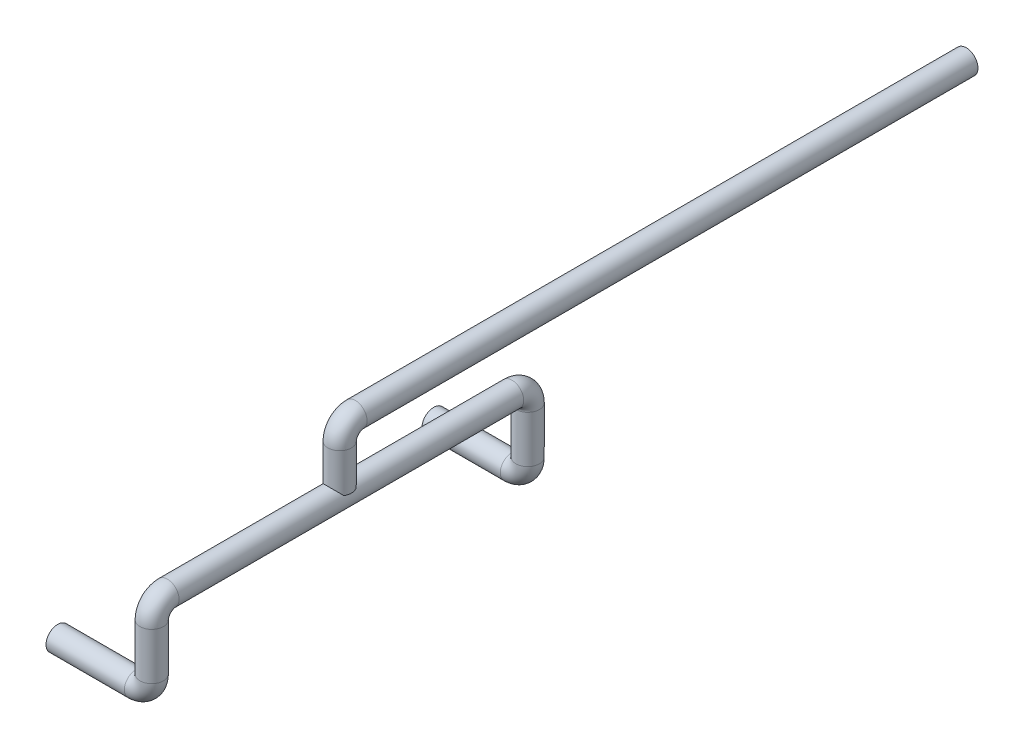
ISO-10303-21;
HEADER;
FILE_DESCRIPTION(('STEP AP214'),'2;1');
FILE_NAME('part.step','',(''),(''),'','','');
FILE_SCHEMA(('AUTOMOTIVE_DESIGN { 1 0 10303 214 1 1 1 1 }'));
ENDSEC;
DATA;
#1=APPLICATION_CONTEXT('core data for automotive mechanical design processes');
#2=APPLICATION_PROTOCOL_DEFINITION('international standard','automotive_design',2000,#1);
#3=PRODUCT_CONTEXT('',#1,'mechanical');
#4=PRODUCT('Part','Part','',(#3));
#5=PRODUCT_RELATED_PRODUCT_CATEGORY('part','',(#4));
#6=PRODUCT_DEFINITION_FORMATION('','',#4);
#7=PRODUCT_DEFINITION_CONTEXT('part definition',#1,'design');
#8=PRODUCT_DEFINITION('design','',#6,#7);
#9=PRODUCT_DEFINITION_SHAPE('','',#8);
#10=(LENGTH_UNIT() NAMED_UNIT(*) SI_UNIT(.MILLI.,.METRE.));
#11=(NAMED_UNIT(*) PLANE_ANGLE_UNIT() SI_UNIT($,.RADIAN.));
#12=(NAMED_UNIT(*) SI_UNIT($,.STERADIAN.) SOLID_ANGLE_UNIT());
#13=UNCERTAINTY_MEASURE_WITH_UNIT(LENGTH_MEASURE(1.E-05),#10,'distance_accuracy_value','');
#14=(GEOMETRIC_REPRESENTATION_CONTEXT(3) GLOBAL_UNCERTAINTY_ASSIGNED_CONTEXT((#13)) GLOBAL_UNIT_ASSIGNED_CONTEXT((#10,
#11,#12)) REPRESENTATION_CONTEXT('',''));
#15=CARTESIAN_POINT('',(0.,0.,0.));
#16=DIRECTION('',(0.,0.,1.));
#17=DIRECTION('',(1.,0.,0.));
#18=AXIS2_PLACEMENT_3D('',#15,#16,#17);
#19=CARTESIAN_POINT('',(0.,0.,110.));
#20=DIRECTION('',(0.,0.,-1.));
#21=DIRECTION('',(-1.,0.,0.));
#22=AXIS2_PLACEMENT_3D('',#19,#20,#21);
#23=CYLINDRICAL_SURFACE('',#22,7.50000000000001);
#24=CARTESIAN_POINT('',(0.,0.,110.));
#25=DIRECTION('',(0.,0.,1.));
#26=DIRECTION('',(0.,1.,0.));
#27=AXIS2_PLACEMENT_3D('',#24,#25,#26);
#28=CIRCLE('',#27,7.50000000000001);
#29=CARTESIAN_POINT('',(0.,7.5,110.));
#30=VERTEX_POINT('',#29);
#31=EDGE_CURVE('E211',#30,#30,#28,.T.);
#32=ORIENTED_EDGE('',*,*,#31,.F.);
#33=EDGE_LOOP('',(#32));
#34=FACE_BOUND('',#33,.T.);
#35=CARTESIAN_POINT('',(0.,0.,-110.));
#36=DIRECTION('',(0.,0.,1.));
#37=DIRECTION('',(0.,1.,0.));
#38=AXIS2_PLACEMENT_3D('',#35,#36,#37);
#39=CIRCLE('',#38,7.50000000000001);
#40=CARTESIAN_POINT('',(0.,7.50000000000001,-110.));
#41=VERTEX_POINT('',#40);
#42=EDGE_CURVE('E214',#41,#41,#39,.T.);
#43=ORIENTED_EDGE('',*,*,#42,.T.);
#44=EDGE_LOOP('',(#43));
#45=FACE_BOUND('',#44,.T.);
#46=CARTESIAN_POINT('',(0.,0.,0.));
#47=DIRECTION('',(0.,0.707106781186547,-0.707106781186547));
#48=DIRECTION('',(0.,-0.707106781186547,-0.707106781186547));
#49=AXIS2_PLACEMENT_3D('',#46,#47,#48);
#50=ELLIPSE('',#49,10.6066017177982,7.5);
#51=CARTESIAN_POINT('',(-6.47252088797244,3.78899371268421,3.78899371268421));
#52=VERTEX_POINT('',#51);
#53=CARTESIAN_POINT('',(6.47252088797245,3.78899371268421,3.78899371268418));
#54=VERTEX_POINT('',#53);
#55=EDGE_CURVE('E103',#52,#54,#50,.T.);
#56=ORIENTED_EDGE('',*,*,#55,.F.);
#57=DIRECTION('',(0.,0.,-1.));
#58=VECTOR('',#57,1.);
#59=CARTESIAN_POINT('',(-6.47252088797244,3.78899371268421,110.));
#60=LINE('',#59,#58);
#61=CARTESIAN_POINT('',(-6.47252088797244,3.78899371268421,-3.78899371268421));
#62=VERTEX_POINT('',#61);
#63=EDGE_CURVE('E234',#52,#62,#60,.T.);
#64=ORIENTED_EDGE('',*,*,#63,.T.);
#65=CARTESIAN_POINT('',(0.,0.,0.));
#66=DIRECTION('',(0.,-0.707106781186547,-0.707106781186547));
#67=DIRECTION('',(0.,0.707106781186547,-0.707106781186547));
#68=AXIS2_PLACEMENT_3D('',#65,#66,#67);
#69=ELLIPSE('',#68,10.6066017177982,7.5);
#70=CARTESIAN_POINT('',(6.47252088797244,3.78899371268421,-3.78899371268421));
#71=VERTEX_POINT('',#70);
#72=EDGE_CURVE('E229',#71,#62,#69,.F.);
#73=ORIENTED_EDGE('',*,*,#72,.F.);
#74=DIRECTION('',(0.,0.,-1.));
#75=VECTOR('',#74,1.);
#76=CARTESIAN_POINT('',(6.47252088797245,3.78899371268421,110.));
#77=LINE('',#76,#75);
#78=EDGE_CURVE('E232',#71,#54,#77,.F.);
#79=ORIENTED_EDGE('',*,*,#78,.T.);
#80=EDGE_LOOP('',(#56,#64,#73,#79));
#81=FACE_BOUND('',#80,.T.);
#82=ADVANCED_FACE('F81',(#34,#45,#81),#23,.T.);
#83=CARTESIAN_POINT('',(-60.,-50.,120.));
#84=DIRECTION('',(-1.,0.,0.));
#85=DIRECTION('',(0.,0.,1.));
#86=AXIS2_PLACEMENT_3D('',#83,#84,#85);
#87=PLANE('',#86);
#88=CARTESIAN_POINT('',(-60.,-50.,120.));
#89=DIRECTION('',(-1.,0.,0.));
#90=DIRECTION('',(0.,0.,1.));
#91=AXIS2_PLACEMENT_3D('',#88,#89,#90);
#92=CIRCLE('',#91,6.25000000000001);
#93=CARTESIAN_POINT('',(-60.,-50.,126.25));
#94=VERTEX_POINT('',#93);
#95=EDGE_CURVE('E158',#94,#94,#92,.T.);
#96=ORIENTED_EDGE('',*,*,#95,.F.);
#97=EDGE_LOOP('',(#96));
#98=FACE_BOUND('',#97,.T.);
#99=CARTESIAN_POINT('',(-60.,-50.,120.));
#100=DIRECTION('',(-1.,0.,0.));
#101=DIRECTION('',(0.,0.,1.));
#102=AXIS2_PLACEMENT_3D('',#99,#100,#101);
#103=CIRCLE('',#102,7.50000000000001);
#104=CARTESIAN_POINT('',(-60.,-50.,127.5));
#105=VERTEX_POINT('',#104);
#106=EDGE_CURVE('E199',#105,#105,#103,.T.);
#107=ORIENTED_EDGE('',*,*,#106,.T.);
#108=EDGE_LOOP('',(#107));
#109=FACE_BOUND('',#108,.T.);
#110=ADVANCED_FACE('F83',(#98,#109),#87,.T.);
#111=CARTESIAN_POINT('',(-60.,-50.,-120.));
#112=DIRECTION('',(1.,0.,0.));
#113=DIRECTION('',(0.,0.,-1.));
#114=AXIS2_PLACEMENT_3D('',#111,#112,#113);
#115=PLANE('',#114);
#116=CARTESIAN_POINT('',(-60.,-50.,-120.));
#117=DIRECTION('',(1.,0.,0.));
#118=DIRECTION('',(0.,0.,-1.));
#119=AXIS2_PLACEMENT_3D('',#116,#117,#118);
#120=CIRCLE('',#119,6.25000000000001);
#121=CARTESIAN_POINT('',(-60.,-50.,-126.25));
#122=VERTEX_POINT('',#121);
#123=EDGE_CURVE('E155',#122,#122,#120,.T.);
#124=ORIENTED_EDGE('',*,*,#123,.T.);
#125=EDGE_LOOP('',(#124));
#126=FACE_BOUND('',#125,.T.);
#127=CARTESIAN_POINT('',(-60.,-50.,-120.));
#128=DIRECTION('',(1.,0.,0.));
#129=DIRECTION('',(0.,0.,-1.));
#130=AXIS2_PLACEMENT_3D('',#127,#128,#129);
#131=CIRCLE('',#130,7.50000000000001);
#132=CARTESIAN_POINT('',(-60.,-50.,-127.5));
#133=VERTEX_POINT('',#132);
#134=EDGE_CURVE('E226',#133,#133,#131,.T.);
#135=ORIENTED_EDGE('',*,*,#134,.F.);
#136=EDGE_LOOP('',(#135));
#137=FACE_BOUND('',#136,.T.);
#138=ADVANCED_FACE('F270',(#126,#137),#115,.F.);
#139=CARTESIAN_POINT('',(-60.,-50.,120.));
#140=DIRECTION('',(1.,0.,0.));
#141=DIRECTION('',(0.,0.,-1.));
#142=AXIS2_PLACEMENT_3D('',#139,#140,#141);
#143=CYLINDRICAL_SURFACE('',#142,7.50000000000001);
#144=CARTESIAN_POINT('',(-10.,-50.,120.));
#145=DIRECTION('',(-1.,0.,0.));
#146=DIRECTION('',(0.,0.,1.));
#147=AXIS2_PLACEMENT_3D('',#144,#145,#146);
#148=CIRCLE('',#147,7.50000000000001);
#149=CARTESIAN_POINT('',(-10.,-57.5,120.));
#150=VERTEX_POINT('',#149);
#151=EDGE_CURVE('E202',#150,#150,#148,.T.);
#152=ORIENTED_EDGE('',*,*,#151,.T.);
#153=EDGE_LOOP('',(#152));
#154=FACE_BOUND('',#153,.T.);
#155=ORIENTED_EDGE('',*,*,#106,.F.);
#156=EDGE_LOOP('',(#155));
#157=FACE_BOUND('',#156,.T.);
#158=ADVANCED_FACE('F294',(#154,#157),#143,.T.);
#159=CARTESIAN_POINT('',(-10.,-40.,120.));
#160=DIRECTION('',(0.,0.,1.));
#161=DIRECTION('',(1.,0.,0.));
#162=AXIS2_PLACEMENT_3D('',#159,#160,#161);
#163=TOROIDAL_SURFACE('',#162,10.,7.50000000000001);
#164=CARTESIAN_POINT('',(0.,-40.,120.));
#165=DIRECTION('',(0.,-1.,0.));
#166=DIRECTION('',(0.,0.,1.));
#167=AXIS2_PLACEMENT_3D('',#164,#165,#166);
#168=CIRCLE('',#167,7.50000000000001);
#169=CARTESIAN_POINT('',(7.50000000000002,-40.,120.));
#170=VERTEX_POINT('',#169);
#171=EDGE_CURVE('E205',#170,#170,#168,.T.);
#172=CARTESIAN_POINT('',(-10.,-40.,120.));
#173=DIRECTION('',(0.,0.,1.));
#174=DIRECTION('',(1.,0.,0.));
#175=AXIS2_PLACEMENT_3D('',#172,#173,#174);
#176=CIRCLE('',#175,17.5);
#177=EDGE_CURVE('',#150,#170,#176,.T.);
#178=ORIENTED_EDGE('',*,*,#151,.F.);
#179=ORIENTED_EDGE('',*,*,#171,.T.);
#180=ORIENTED_EDGE('',*,*,#177,.T.);
#181=ORIENTED_EDGE('',*,*,#177,.F.);
#182=EDGE_LOOP('',(#178,#180,#179,#181));
#183=FACE_BOUND('',#182,.T.);
#184=ADVANCED_FACE('F299',(#183),#163,.T.);
#185=CARTESIAN_POINT('',(0.,-40.,120.));
#186=DIRECTION('',(0.,1.,0.));
#187=DIRECTION('',(-1.,0.,0.));
#188=AXIS2_PLACEMENT_3D('',#185,#186,#187);
#189=CYLINDRICAL_SURFACE('',#188,7.50000000000001);
#190=CARTESIAN_POINT('',(0.,-10.,120.));
#191=DIRECTION('',(0.,-1.,0.));
#192=DIRECTION('',(0.,0.,1.));
#193=AXIS2_PLACEMENT_3D('',#190,#191,#192);
#194=CIRCLE('',#193,7.50000000000001);
#195=CARTESIAN_POINT('',(0.,-10.,127.5));
#196=VERTEX_POINT('',#195);
#197=EDGE_CURVE('E208',#196,#196,#194,.T.);
#198=ORIENTED_EDGE('',*,*,#197,.T.);
#199=EDGE_LOOP('',(#198));
#200=FACE_BOUND('',#199,.T.);
#201=ORIENTED_EDGE('',*,*,#171,.F.);
#202=EDGE_LOOP('',(#201));
#203=FACE_BOUND('',#202,.T.);
#204=ADVANCED_FACE('F361',(#200,#203),#189,.T.);
#205=CARTESIAN_POINT('',(0.,-10.,110.));
#206=DIRECTION('',(-1.,0.,0.));
#207=DIRECTION('',(0.,0.,1.));
#208=AXIS2_PLACEMENT_3D('',#205,#206,#207);
#209=TOROIDAL_SURFACE('',#208,9.99999999999999,7.50000000000001);
#210=CARTESIAN_POINT('',(0.,-10.,110.));
#211=DIRECTION('',(-1.,0.,0.));
#212=DIRECTION('',(0.,0.,1.));
#213=AXIS2_PLACEMENT_3D('',#210,#211,#212);
#214=CIRCLE('',#213,17.5);
#215=EDGE_CURVE('',#196,#30,#214,.T.);
#216=ORIENTED_EDGE('',*,*,#197,.F.);
#217=ORIENTED_EDGE('',*,*,#31,.T.);
#218=ORIENTED_EDGE('',*,*,#215,.T.);
#219=ORIENTED_EDGE('',*,*,#215,.F.);
#220=EDGE_LOOP('',(#216,#218,#217,#219));
#221=FACE_BOUND('',#220,.T.);
#222=ADVANCED_FACE('F364',(#221),#209,.T.);
#223=CARTESIAN_POINT('',(0.,-10.,-110.));
#224=DIRECTION('',(-1.,0.,0.));
#225=DIRECTION('',(0.,0.,1.));
#226=AXIS2_PLACEMENT_3D('',#223,#224,#225);
#227=TOROIDAL_SURFACE('',#226,10.,7.50000000000001);
#228=CARTESIAN_POINT('',(0.,-9.99999999999999,-120.));
#229=DIRECTION('',(0.,1.,0.));
#230=DIRECTION('',(0.,0.,-1.));
#231=AXIS2_PLACEMENT_3D('',#228,#229,#230);
#232=CIRCLE('',#231,7.50000000000001);
#233=CARTESIAN_POINT('',(0.,-9.99999999999999,-127.5));
#234=VERTEX_POINT('',#233);
#235=EDGE_CURVE('E217',#234,#234,#232,.T.);
#236=CARTESIAN_POINT('',(0.,-10.,-110.));
#237=DIRECTION('',(-1.,0.,0.));
#238=DIRECTION('',(0.,0.,1.));
#239=AXIS2_PLACEMENT_3D('',#236,#237,#238);
#240=CIRCLE('',#239,17.5);
#241=EDGE_CURVE('',#41,#234,#240,.T.);
#242=ORIENTED_EDGE('',*,*,#42,.F.);
#243=ORIENTED_EDGE('',*,*,#235,.T.);
#244=ORIENTED_EDGE('',*,*,#241,.T.);
#245=ORIENTED_EDGE('',*,*,#241,.F.);
#246=EDGE_LOOP('',(#242,#244,#243,#245));
#247=FACE_BOUND('',#246,.T.);
#248=ADVANCED_FACE('F367',(#247),#227,.T.);
#249=CARTESIAN_POINT('',(0.,-9.99999999999999,-120.));
#250=DIRECTION('',(0.,-1.,0.));
#251=DIRECTION('',(0.,0.,-1.));
#252=AXIS2_PLACEMENT_3D('',#249,#250,#251);
#253=CYLINDRICAL_SURFACE('',#252,7.50000000000001);
#254=CARTESIAN_POINT('',(0.,-40.,-120.));
#255=DIRECTION('',(0.,1.,0.));
#256=DIRECTION('',(0.,0.,-1.));
#257=AXIS2_PLACEMENT_3D('',#254,#255,#256);
#258=CIRCLE('',#257,7.50000000000001);
#259=CARTESIAN_POINT('',(7.50000000000002,-40.,-120.));
#260=VERTEX_POINT('',#259);
#261=EDGE_CURVE('E220',#260,#260,#258,.T.);
#262=ORIENTED_EDGE('',*,*,#261,.T.);
#263=EDGE_LOOP('',(#262));
#264=FACE_BOUND('',#263,.T.);
#265=ORIENTED_EDGE('',*,*,#235,.F.);
#266=EDGE_LOOP('',(#265));
#267=FACE_BOUND('',#266,.T.);
#268=ADVANCED_FACE('F288',(#264,#267),#253,.T.);
#269=CARTESIAN_POINT('',(-10.,-40.,-120.));
#270=DIRECTION('',(0.,0.,-1.));
#271=DIRECTION('',(-1.,0.,0.));
#272=AXIS2_PLACEMENT_3D('',#269,#270,#271);
#273=TOROIDAL_SURFACE('',#272,10.,7.50000000000001);
#274=CARTESIAN_POINT('',(-10.,-50.,-120.));
#275=DIRECTION('',(1.,0.,0.));
#276=DIRECTION('',(0.,0.,-1.));
#277=AXIS2_PLACEMENT_3D('',#274,#275,#276);
#278=CIRCLE('',#277,7.50000000000001);
#279=CARTESIAN_POINT('',(-10.,-57.5,-120.));
#280=VERTEX_POINT('',#279);
#281=EDGE_CURVE('E223',#280,#280,#278,.T.);
#282=CARTESIAN_POINT('',(-10.,-40.,-120.));
#283=DIRECTION('',(0.,0.,-1.));
#284=DIRECTION('',(-1.,0.,0.));
#285=AXIS2_PLACEMENT_3D('',#282,#283,#284);
#286=CIRCLE('',#285,17.5);
#287=EDGE_CURVE('',#260,#280,#286,.T.);
#288=ORIENTED_EDGE('',*,*,#261,.F.);
#289=ORIENTED_EDGE('',*,*,#281,.T.);
#290=ORIENTED_EDGE('',*,*,#287,.T.);
#291=ORIENTED_EDGE('',*,*,#287,.F.);
#292=EDGE_LOOP('',(#288,#290,#289,#291));
#293=FACE_BOUND('',#292,.T.);
#294=ADVANCED_FACE('F278',(#293),#273,.T.);
#295=CARTESIAN_POINT('',(-9.99999999999999,-50.,-120.));
#296=DIRECTION('',(-1.,0.,0.));
#297=DIRECTION('',(0.,0.,1.));
#298=AXIS2_PLACEMENT_3D('',#295,#296,#297);
#299=CYLINDRICAL_SURFACE('',#298,7.50000000000001);
#300=ORIENTED_EDGE('',*,*,#134,.T.);
#301=EDGE_LOOP('',(#300));
#302=FACE_BOUND('',#301,.T.);
#303=ORIENTED_EDGE('',*,*,#281,.F.);
#304=EDGE_LOOP('',(#303));
#305=FACE_BOUND('',#304,.T.);
#306=ADVANCED_FACE('F266',(#302,#305),#299,.T.);
#307=CARTESIAN_POINT('',(0.,3.78899371268421,0.));
#308=DIRECTION('',(0.,-1.,0.));
#309=DIRECTION('',(1.,0.,0.));
#310=AXIS2_PLACEMENT_3D('',#307,#308,#309);
#311=PLANE('',#310);
#312=ORIENTED_EDGE('',*,*,#63,.F.);
#313=CARTESIAN_POINT('',(0.,3.78899371268421,0.));
#314=DIRECTION('',(0.,-1.,0.));
#315=DIRECTION('',(1.,0.,0.));
#316=AXIS2_PLACEMENT_3D('',#313,#314,#315);
#317=CIRCLE('',#316,7.5);
#318=EDGE_CURVE('E189',#52,#62,#317,.T.);
#319=ORIENTED_EDGE('',*,*,#318,.T.);
#320=EDGE_LOOP('',(#312,#319));
#321=FACE_BOUND('',#320,.T.);
#322=ADVANCED_FACE('F272',(#321),#311,.T.);
#323=ORIENTED_EDGE('',*,*,#78,.F.);
#324=EDGE_CURVE('E186',#71,#54,#317,.T.);
#325=ORIENTED_EDGE('',*,*,#324,.T.);
#326=EDGE_LOOP('',(#323,#325));
#327=FACE_BOUND('',#326,.T.);
#328=ADVANCED_FACE('F285',(#327),#311,.T.);
#329=CARTESIAN_POINT('',(0.,3.78899371268421,0.));
#330=DIRECTION('',(0.,1.,0.));
#331=DIRECTION('',(0.,0.,1.));
#332=AXIS2_PLACEMENT_3D('',#329,#330,#331);
#333=CYLINDRICAL_SURFACE('',#332,7.5);
#334=CARTESIAN_POINT('',(0.,28.7889937126842,0.));
#335=DIRECTION('',(0.,-1.,0.));
#336=DIRECTION('',(1.,0.,0.));
#337=AXIS2_PLACEMENT_3D('',#334,#335,#336);
#338=CIRCLE('',#337,7.5);
#339=CARTESIAN_POINT('',(0.,28.7889937126843,7.5));
#340=VERTEX_POINT('',#339);
#341=EDGE_CURVE('E190',#340,#340,#338,.T.);
#342=ORIENTED_EDGE('',*,*,#341,.T.);
#343=EDGE_LOOP('',(#342));
#344=FACE_BOUND('',#343,.T.);
#345=ORIENTED_EDGE('',*,*,#318,.F.);
#346=ORIENTED_EDGE('',*,*,#55,.T.);
#347=ORIENTED_EDGE('',*,*,#324,.F.);
#348=ORIENTED_EDGE('',*,*,#72,.T.);
#349=EDGE_LOOP('',(#345,#346,#347,#348));
#350=FACE_BOUND('',#349,.T.);
#351=ADVANCED_FACE('F345',(#344,#350),#333,.T.);
#352=CARTESIAN_POINT('',(0.,38.7889937126842,-400.));
#353=DIRECTION('',(0.,0.,1.));
#354=DIRECTION('',(1.,0.,0.));
#355=AXIS2_PLACEMENT_3D('',#352,#353,#354);
#356=PLANE('',#355);
#357=CARTESIAN_POINT('',(0.,38.7889937126841,-400.));
#358=DIRECTION('',(0.,0.,1.));
#359=DIRECTION('',(1.,0.,0.));
#360=AXIS2_PLACEMENT_3D('',#357,#358,#359);
#361=CIRCLE('',#360,6.25);
#362=CARTESIAN_POINT('',(6.25,38.7889937126841,-400.));
#363=VERTEX_POINT('',#362);
#364=EDGE_CURVE('E146',#363,#363,#361,.T.);
#365=ORIENTED_EDGE('',*,*,#364,.T.);
#366=EDGE_LOOP('',(#365));
#367=FACE_BOUND('',#366,.T.);
#368=CARTESIAN_POINT('',(0.,38.7889937126842,-400.));
#369=DIRECTION('',(0.,0.,1.));
#370=DIRECTION('',(1.,0.,0.));
#371=AXIS2_PLACEMENT_3D('',#368,#369,#370);
#372=CIRCLE('',#371,7.5);
#373=CARTESIAN_POINT('',(7.5,38.7889937126842,-400.));
#374=VERTEX_POINT('',#373);
#375=EDGE_CURVE('E196',#374,#374,#372,.T.);
#376=ORIENTED_EDGE('',*,*,#375,.F.);
#377=EDGE_LOOP('',(#376));
#378=FACE_BOUND('',#377,.T.);
#379=ADVANCED_FACE('F344',(#367,#378),#356,.F.);
#380=CARTESIAN_POINT('',(0.,28.7889937126842,-10.));
#381=DIRECTION('',(-1.,0.,0.));
#382=DIRECTION('',(0.,0.,1.));
#383=AXIS2_PLACEMENT_3D('',#380,#381,#382);
#384=TOROIDAL_SURFACE('',#383,10.,7.5);
#385=CARTESIAN_POINT('',(0.,38.7889937126842,-10.0000000000001));
#386=DIRECTION('',(0.,0.,1.));
#387=DIRECTION('',(1.,0.,0.));
#388=AXIS2_PLACEMENT_3D('',#385,#386,#387);
#389=CIRCLE('',#388,7.5);
#390=CARTESIAN_POINT('',(0.,46.2889937126842,-10.0000000000001));
#391=VERTEX_POINT('',#390);
#392=EDGE_CURVE('E193',#391,#391,#389,.T.);
#393=CARTESIAN_POINT('',(0.,28.7889937126842,-10.));
#394=DIRECTION('',(-1.,0.,0.));
#395=DIRECTION('',(0.,0.,1.));
#396=AXIS2_PLACEMENT_3D('',#393,#394,#395);
#397=CIRCLE('',#396,17.5);
#398=EDGE_CURVE('',#340,#391,#397,.T.);
#399=ORIENTED_EDGE('',*,*,#341,.F.);
#400=ORIENTED_EDGE('',*,*,#392,.T.);
#401=ORIENTED_EDGE('',*,*,#398,.T.);
#402=ORIENTED_EDGE('',*,*,#398,.F.);
#403=EDGE_LOOP('',(#399,#401,#400,#402));
#404=FACE_BOUND('',#403,.T.);
#405=ADVANCED_FACE('F349',(#404),#384,.T.);
#406=CARTESIAN_POINT('',(0.,38.7889937126842,-10.0000000000001));
#407=DIRECTION('',(0.,0.,-1.));
#408=DIRECTION('',(-1.,0.,0.));
#409=AXIS2_PLACEMENT_3D('',#406,#407,#408);
#410=CYLINDRICAL_SURFACE('',#409,7.5);
#411=ORIENTED_EDGE('',*,*,#375,.T.);
#412=EDGE_LOOP('',(#411));
#413=FACE_BOUND('',#412,.T.);
#414=ORIENTED_EDGE('',*,*,#392,.F.);
#415=EDGE_LOOP('',(#414));
#416=FACE_BOUND('',#415,.T.);
#417=ADVANCED_FACE('F342',(#413,#416),#410,.T.);
#418=CARTESIAN_POINT('',(-64.9999999999999,-50.,120.));
#419=DIRECTION('',(1.,0.,0.));
#420=DIRECTION('',(0.,0.,-1.));
#421=AXIS2_PLACEMENT_3D('',#418,#419,#420);
#422=CYLINDRICAL_SURFACE('',#421,6.25000000000001);
#423=CARTESIAN_POINT('',(-10.,-50.,120.));
#424=DIRECTION('',(-1.,0.,0.));
#425=DIRECTION('',(0.,0.,1.));
#426=AXIS2_PLACEMENT_3D('',#423,#424,#425);
#427=CIRCLE('',#426,6.25000000000001);
#428=CARTESIAN_POINT('',(-10.,-56.25,120.));
#429=VERTEX_POINT('',#428);
#430=EDGE_CURVE('E154',#429,#429,#427,.T.);
#431=ORIENTED_EDGE('',*,*,#430,.F.);
#432=EDGE_LOOP('',(#431));
#433=FACE_BOUND('',#432,.T.);
#434=ORIENTED_EDGE('',*,*,#95,.T.);
#435=EDGE_LOOP('',(#434));
#436=FACE_BOUND('',#435,.T.);
#437=ADVANCED_FACE('F311',(#433,#436),#422,.F.);
#438=CARTESIAN_POINT('',(-10.,-40.,120.));
#439=DIRECTION('',(0.,0.,1.));
#440=DIRECTION('',(1.,0.,0.));
#441=AXIS2_PLACEMENT_3D('',#438,#439,#440);
#442=TOROIDAL_SURFACE('',#441,10.,6.25000000000001);
#443=CARTESIAN_POINT('',(0.,-40.,120.));
#444=DIRECTION('',(0.,-1.,0.));
#445=DIRECTION('',(0.,0.,1.));
#446=AXIS2_PLACEMENT_3D('',#443,#444,#445);
#447=CIRCLE('',#446,6.25000000000001);
#448=CARTESIAN_POINT('',(6.25000000000002,-40.,120.));
#449=VERTEX_POINT('',#448);
#450=EDGE_CURVE('E162',#449,#449,#447,.T.);
#451=CARTESIAN_POINT('',(-10.,-40.,120.));
#452=DIRECTION('',(0.,0.,1.));
#453=DIRECTION('',(1.,0.,0.));
#454=AXIS2_PLACEMENT_3D('',#451,#452,#453);
#455=CIRCLE('',#454,16.25);
#456=EDGE_CURVE('',#429,#449,#455,.T.);
#457=ORIENTED_EDGE('',*,*,#430,.T.);
#458=ORIENTED_EDGE('',*,*,#450,.F.);
#459=ORIENTED_EDGE('',*,*,#456,.T.);
#460=ORIENTED_EDGE('',*,*,#456,.F.);
#461=EDGE_LOOP('',(#457,#459,#458,#460));
#462=FACE_BOUND('',#461,.T.);
#463=ADVANCED_FACE('F341',(#462),#442,.F.);
#464=CARTESIAN_POINT('',(0.,-40.,120.));
#465=DIRECTION('',(0.,1.,0.));
#466=DIRECTION('',(-1.,0.,0.));
#467=AXIS2_PLACEMENT_3D('',#464,#465,#466);
#468=CYLINDRICAL_SURFACE('',#467,6.25000000000001);
#469=CARTESIAN_POINT('',(0.,-10.,120.));
#470=DIRECTION('',(0.,-1.,0.));
#471=DIRECTION('',(0.,0.,1.));
#472=AXIS2_PLACEMENT_3D('',#469,#470,#471);
#473=CIRCLE('',#472,6.25000000000001);
#474=CARTESIAN_POINT('',(0.,-10.,126.25));
#475=VERTEX_POINT('',#474);
#476=EDGE_CURVE('E165',#475,#475,#473,.T.);
#477=ORIENTED_EDGE('',*,*,#476,.F.);
#478=EDGE_LOOP('',(#477));
#479=FACE_BOUND('',#478,.T.);
#480=ORIENTED_EDGE('',*,*,#450,.T.);
#481=EDGE_LOOP('',(#480));
#482=FACE_BOUND('',#481,.T.);
#483=ADVANCED_FACE('F465',(#479,#482),#468,.F.);
#484=CARTESIAN_POINT('',(0.,-10.,110.));
#485=DIRECTION('',(-1.,0.,0.));
#486=DIRECTION('',(0.,0.,1.));
#487=AXIS2_PLACEMENT_3D('',#484,#485,#486);
#488=TOROIDAL_SURFACE('',#487,9.99999999999999,6.25000000000001);
#489=CARTESIAN_POINT('',(0.,0.,110.));
#490=DIRECTION('',(0.,0.,1.));
#491=DIRECTION('',(0.,1.,0.));
#492=AXIS2_PLACEMENT_3D('',#489,#490,#491);
#493=CIRCLE('',#492,6.25000000000001);
#494=CARTESIAN_POINT('',(0.,6.25,110.));
#495=VERTEX_POINT('',#494);
#496=EDGE_CURVE('E168',#495,#495,#493,.T.);
#497=CARTESIAN_POINT('',(0.,-10.,110.));
#498=DIRECTION('',(-1.,0.,0.));
#499=DIRECTION('',(0.,0.,1.));
#500=AXIS2_PLACEMENT_3D('',#497,#498,#499);
#501=CIRCLE('',#500,16.25);
#502=EDGE_CURVE('',#475,#495,#501,.T.);
#503=ORIENTED_EDGE('',*,*,#476,.T.);
#504=ORIENTED_EDGE('',*,*,#496,.F.);
#505=ORIENTED_EDGE('',*,*,#502,.T.);
#506=ORIENTED_EDGE('',*,*,#502,.F.);
#507=EDGE_LOOP('',(#503,#505,#504,#506));
#508=FACE_BOUND('',#507,.T.);
#509=ADVANCED_FACE('F335',(#508),#488,.F.);
#510=CARTESIAN_POINT('',(0.,0.,110.));
#511=DIRECTION('',(0.,0.,-1.));
#512=DIRECTION('',(-1.,0.,0.));
#513=AXIS2_PLACEMENT_3D('',#510,#511,#512);
#514=CYLINDRICAL_SURFACE('',#513,6.25000000000001);
#515=DIRECTION('',(0.,0.,-1.));
#516=VECTOR('',#515,1.);
#517=CARTESIAN_POINT('',(-4.97051573231998,3.7889937126841,110.));
#518=LINE('',#517,#516);
#519=CARTESIAN_POINT('',(-4.97051573231998,3.7889937126841,3.7889937126841));
#520=VERTEX_POINT('',#519);
#521=CARTESIAN_POINT('',(-4.97051573231998,3.7889937126841,0.));
#522=VERTEX_POINT('',#521);
#523=EDGE_CURVE('E136',#520,#522,#518,.T.);
#524=ORIENTED_EDGE('',*,*,#523,.F.);
#525=CARTESIAN_POINT('',(0.,0.,0.));
#526=DIRECTION('',(0.,0.707106781186547,-0.707106781186547));
#527=DIRECTION('',(0.,-0.707106781186547,-0.707106781186547));
#528=AXIS2_PLACEMENT_3D('',#525,#526,#527);
#529=ELLIPSE('',#528,8.83883476483185,6.25);
#530=CARTESIAN_POINT('',(4.97051573231998,3.7889937126841,3.7889937126841));
#531=VERTEX_POINT('',#530);
#532=EDGE_CURVE('E137',#520,#531,#529,.T.);
#533=ORIENTED_EDGE('',*,*,#532,.T.);
#534=DIRECTION('',(0.,0.,-1.));
#535=VECTOR('',#534,1.);
#536=CARTESIAN_POINT('',(4.97051573231999,3.7889937126841,110.));
#537=LINE('',#536,#535);
#538=CARTESIAN_POINT('',(4.97051573231999,3.7889937126841,0.));
#539=VERTEX_POINT('',#538);
#540=EDGE_CURVE('E127',#539,#531,#537,.F.);
#541=ORIENTED_EDGE('',*,*,#540,.F.);
#542=CARTESIAN_POINT('',(0.,0.,0.));
#543=DIRECTION('',(0.,0.,1.));
#544=DIRECTION('',(0.,1.,0.));
#545=AXIS2_PLACEMENT_3D('',#542,#543,#544);
#546=CIRCLE('',#545,6.25000000000001);
#547=EDGE_CURVE('E171',#522,#539,#546,.T.);
#548=ORIENTED_EDGE('',*,*,#547,.F.);
#549=EDGE_LOOP('',(#524,#533,#541,#548));
#550=FACE_BOUND('',#549,.T.);
#551=ORIENTED_EDGE('',*,*,#496,.T.);
#552=EDGE_LOOP('',(#551));
#553=FACE_BOUND('',#552,.T.);
#554=ADVANCED_FACE('F144',(#550,#553),#514,.F.);
#555=CARTESIAN_POINT('',(0.,0.,0.));
#556=DIRECTION('',(0.,0.,-1.));
#557=DIRECTION('',(-1.,0.,0.));
#558=AXIS2_PLACEMENT_3D('',#555,#556,#557);
#559=CYLINDRICAL_SURFACE('',#558,6.25000000000001);
#560=DIRECTION('',(0.,0.,-1.));
#561=VECTOR('',#560,1.);
#562=CARTESIAN_POINT('',(-4.97051573231998,3.7889937126841,0.));
#563=LINE('',#562,#561);
#564=CARTESIAN_POINT('',(-4.97051573231998,3.7889937126841,-3.7889937126841));
#565=VERTEX_POINT('',#564);
#566=EDGE_CURVE('E12',#522,#565,#563,.T.);
#567=ORIENTED_EDGE('',*,*,#566,.F.);
#568=ORIENTED_EDGE('',*,*,#547,.T.);
#569=DIRECTION('',(0.,0.,-1.));
#570=VECTOR('',#569,1.);
#571=CARTESIAN_POINT('',(4.97051573231999,3.7889937126841,0.));
#572=LINE('',#571,#570);
#573=CARTESIAN_POINT('',(4.97051573231998,3.7889937126841,-3.7889937126841));
#574=VERTEX_POINT('',#573);
#575=EDGE_CURVE('E89',#574,#539,#572,.F.);
#576=ORIENTED_EDGE('',*,*,#575,.F.);
#577=CARTESIAN_POINT('',(0.,0.,0.));
#578=DIRECTION('',(0.,-0.707106781186547,-0.707106781186547));
#579=DIRECTION('',(0.,0.707106781186547,-0.707106781186547));
#580=AXIS2_PLACEMENT_3D('',#577,#578,#579);
#581=ELLIPSE('',#580,8.83883476483185,6.25);
#582=EDGE_CURVE('E141',#574,#565,#581,.F.);
#583=ORIENTED_EDGE('',*,*,#582,.T.);
#584=EDGE_LOOP('',(#567,#568,#576,#583));
#585=FACE_BOUND('',#584,.T.);
#586=CARTESIAN_POINT('',(0.,0.,-110.));
#587=DIRECTION('',(0.,0.,1.));
#588=DIRECTION('',(0.,1.,0.));
#589=AXIS2_PLACEMENT_3D('',#586,#587,#588);
#590=CIRCLE('',#589,6.25000000000001);
#591=CARTESIAN_POINT('',(0.,6.25000000000001,-110.));
#592=VERTEX_POINT('',#591);
#593=EDGE_CURVE('E173',#592,#592,#590,.T.);
#594=ORIENTED_EDGE('',*,*,#593,.F.);
#595=EDGE_LOOP('',(#594));
#596=FACE_BOUND('',#595,.T.);
#597=ADVANCED_FACE('F239',(#585,#596),#559,.F.);
#598=CARTESIAN_POINT('',(0.,-10.,-110.));
#599=DIRECTION('',(-1.,0.,0.));
#600=DIRECTION('',(0.,0.,1.));
#601=AXIS2_PLACEMENT_3D('',#598,#599,#600);
#602=TOROIDAL_SURFACE('',#601,10.,6.25000000000001);
#603=CARTESIAN_POINT('',(0.,-10.,-120.));
#604=DIRECTION('',(0.,1.,0.));
#605=DIRECTION('',(0.,0.,-1.));
#606=AXIS2_PLACEMENT_3D('',#603,#604,#605);
#607=CIRCLE('',#606,6.25000000000001);
#608=CARTESIAN_POINT('',(0.,-10.,-126.25));
#609=VERTEX_POINT('',#608);
#610=EDGE_CURVE('E176',#609,#609,#607,.T.);
#611=CARTESIAN_POINT('',(0.,-10.,-110.));
#612=DIRECTION('',(-1.,0.,0.));
#613=DIRECTION('',(0.,0.,1.));
#614=AXIS2_PLACEMENT_3D('',#611,#612,#613);
#615=CIRCLE('',#614,16.25);
#616=EDGE_CURVE('',#592,#609,#615,.T.);
#617=ORIENTED_EDGE('',*,*,#593,.T.);
#618=ORIENTED_EDGE('',*,*,#610,.F.);
#619=ORIENTED_EDGE('',*,*,#616,.T.);
#620=ORIENTED_EDGE('',*,*,#616,.F.);
#621=EDGE_LOOP('',(#617,#619,#618,#620));
#622=FACE_BOUND('',#621,.T.);
#623=ADVANCED_FACE('F322',(#622),#602,.F.);
#624=CARTESIAN_POINT('',(0.,-10.,-120.));
#625=DIRECTION('',(0.,-1.,0.));
#626=DIRECTION('',(0.,0.,-1.));
#627=AXIS2_PLACEMENT_3D('',#624,#625,#626);
#628=CYLINDRICAL_SURFACE('',#627,6.25000000000001);
#629=CARTESIAN_POINT('',(0.,-40.,-120.));
#630=DIRECTION('',(0.,1.,0.));
#631=DIRECTION('',(0.,0.,-1.));
#632=AXIS2_PLACEMENT_3D('',#629,#630,#631);
#633=CIRCLE('',#632,6.25000000000001);
#634=CARTESIAN_POINT('',(6.25000000000001,-40.,-120.));
#635=VERTEX_POINT('',#634);
#636=EDGE_CURVE('E179',#635,#635,#633,.T.);
#637=ORIENTED_EDGE('',*,*,#636,.F.);
#638=EDGE_LOOP('',(#637));
#639=FACE_BOUND('',#638,.T.);
#640=ORIENTED_EDGE('',*,*,#610,.T.);
#641=EDGE_LOOP('',(#640));
#642=FACE_BOUND('',#641,.T.);
#643=ADVANCED_FACE('F316',(#639,#642),#628,.F.);
#644=CARTESIAN_POINT('',(-10.,-40.,-120.));
#645=DIRECTION('',(0.,0.,-1.));
#646=DIRECTION('',(-1.,0.,0.));
#647=AXIS2_PLACEMENT_3D('',#644,#645,#646);
#648=TOROIDAL_SURFACE('',#647,10.,6.25000000000001);
#649=CARTESIAN_POINT('',(-10.0000000000001,-50.,-120.));
#650=DIRECTION('',(1.,0.,0.));
#651=DIRECTION('',(0.,0.,-1.));
#652=AXIS2_PLACEMENT_3D('',#649,#650,#651);
#653=CIRCLE('',#652,6.25000000000001);
#654=CARTESIAN_POINT('',(-10.0000000000002,-56.25,-120.));
#655=VERTEX_POINT('',#654);
#656=EDGE_CURVE('E159',#655,#655,#653,.T.);
#657=CARTESIAN_POINT('',(-10.,-40.,-120.));
#658=DIRECTION('',(0.,0.,-1.));
#659=DIRECTION('',(-1.,0.,0.));
#660=AXIS2_PLACEMENT_3D('',#657,#658,#659);
#661=CIRCLE('',#660,16.25);
#662=EDGE_CURVE('',#635,#655,#661,.T.);
#663=ORIENTED_EDGE('',*,*,#636,.T.);
#664=ORIENTED_EDGE('',*,*,#656,.F.);
#665=ORIENTED_EDGE('',*,*,#662,.T.);
#666=ORIENTED_EDGE('',*,*,#662,.F.);
#667=EDGE_LOOP('',(#663,#665,#664,#666));
#668=FACE_BOUND('',#667,.T.);
#669=ADVANCED_FACE('F309',(#668),#648,.F.);
#670=CARTESIAN_POINT('',(-10.0000000000001,-50.,-120.));
#671=DIRECTION('',(-1.,0.,0.));
#672=DIRECTION('',(0.,0.,1.));
#673=AXIS2_PLACEMENT_3D('',#670,#671,#672);
#674=CYLINDRICAL_SURFACE('',#673,6.25000000000001);
#675=ORIENTED_EDGE('',*,*,#123,.F.);
#676=EDGE_LOOP('',(#675));
#677=FACE_BOUND('',#676,.T.);
#678=ORIENTED_EDGE('',*,*,#656,.T.);
#679=EDGE_LOOP('',(#678));
#680=FACE_BOUND('',#679,.T.);
#681=ADVANCED_FACE('F306',(#677,#680),#674,.F.);
#682=CARTESIAN_POINT('',(0.,3.7889937126841,0.));
#683=DIRECTION('',(0.,-1.,0.));
#684=DIRECTION('',(1.,0.,0.));
#685=AXIS2_PLACEMENT_3D('',#682,#683,#684);
#686=PLANE('',#685);
#687=ORIENTED_EDGE('',*,*,#523,.T.);
#688=ORIENTED_EDGE('',*,*,#566,.T.);
#689=CARTESIAN_POINT('',(0.,3.7889937126841,0.));
#690=DIRECTION('',(0.,-1.,0.));
#691=DIRECTION('',(1.,0.,0.));
#692=AXIS2_PLACEMENT_3D('',#689,#690,#691);
#693=CIRCLE('',#692,6.25);
#694=EDGE_CURVE('E96',#520,#565,#693,.T.);
#695=ORIENTED_EDGE('',*,*,#694,.F.);
#696=EDGE_LOOP('',(#687,#688,#695));
#697=FACE_BOUND('',#696,.T.);
#698=ADVANCED_FACE('F242',(#697),#686,.F.);
#699=ORIENTED_EDGE('',*,*,#540,.T.);
#700=EDGE_CURVE('E130',#574,#531,#693,.T.);
#701=ORIENTED_EDGE('',*,*,#700,.F.);
#702=ORIENTED_EDGE('',*,*,#575,.T.);
#703=EDGE_LOOP('',(#699,#701,#702));
#704=FACE_BOUND('',#703,.T.);
#705=ADVANCED_FACE('F129',(#704),#686,.F.);
#706=CARTESIAN_POINT('',(0.,3.7889937126841,0.));
#707=DIRECTION('',(0.,1.,0.));
#708=DIRECTION('',(0.,0.,1.));
#709=AXIS2_PLACEMENT_3D('',#706,#707,#708);
#710=CYLINDRICAL_SURFACE('',#709,6.25);
#711=CARTESIAN_POINT('',(0.,28.7889937126841,0.));
#712=DIRECTION('',(0.,-1.,0.));
#713=DIRECTION('',(1.,0.,0.));
#714=AXIS2_PLACEMENT_3D('',#711,#712,#713);
#715=CIRCLE('',#714,6.25);
#716=CARTESIAN_POINT('',(0.,28.7889937126841,6.25));
#717=VERTEX_POINT('',#716);
#718=EDGE_CURVE('E243',#717,#717,#715,.T.);
#719=ORIENTED_EDGE('',*,*,#718,.F.);
#720=EDGE_LOOP('',(#719));
#721=FACE_BOUND('',#720,.T.);
#722=ORIENTED_EDGE('',*,*,#694,.T.);
#723=ORIENTED_EDGE('',*,*,#582,.F.);
#724=ORIENTED_EDGE('',*,*,#700,.T.);
#725=ORIENTED_EDGE('',*,*,#532,.F.);
#726=EDGE_LOOP('',(#722,#723,#724,#725));
#727=FACE_BOUND('',#726,.T.);
#728=ADVANCED_FACE('F139',(#721,#727),#710,.F.);
#729=CARTESIAN_POINT('',(0.,28.7889937126842,-10.));
#730=DIRECTION('',(-1.,0.,0.));
#731=DIRECTION('',(0.,0.,1.));
#732=AXIS2_PLACEMENT_3D('',#729,#730,#731);
#733=TOROIDAL_SURFACE('',#732,10.,6.25);
#734=CARTESIAN_POINT('',(0.,38.7889937126842,-9.99999999999995));
#735=DIRECTION('',(0.,0.,1.));
#736=DIRECTION('',(1.,0.,0.));
#737=AXIS2_PLACEMENT_3D('',#734,#735,#736);
#738=CIRCLE('',#737,6.25);
#739=CARTESIAN_POINT('',(0.,45.0389937126842,-9.99999999999992));
#740=VERTEX_POINT('',#739);
#741=EDGE_CURVE('E149',#740,#740,#738,.T.);
#742=CARTESIAN_POINT('',(0.,28.7889937126842,-10.));
#743=DIRECTION('',(-1.,0.,0.));
#744=DIRECTION('',(0.,0.,1.));
#745=AXIS2_PLACEMENT_3D('',#742,#743,#744);
#746=CIRCLE('',#745,16.25);
#747=EDGE_CURVE('',#717,#740,#746,.T.);
#748=ORIENTED_EDGE('',*,*,#718,.T.);
#749=ORIENTED_EDGE('',*,*,#741,.F.);
#750=ORIENTED_EDGE('',*,*,#747,.T.);
#751=ORIENTED_EDGE('',*,*,#747,.F.);
#752=EDGE_LOOP('',(#748,#750,#749,#751));
#753=FACE_BOUND('',#752,.T.);
#754=ADVANCED_FACE('F251',(#753),#733,.F.);
#755=CARTESIAN_POINT('',(0.,38.7889937126841,-9.99999999999995));
#756=DIRECTION('',(0.,0.,-1.));
#757=DIRECTION('',(-1.,0.,0.));
#758=AXIS2_PLACEMENT_3D('',#755,#756,#757);
#759=CYLINDRICAL_SURFACE('',#758,6.25);
#760=ORIENTED_EDGE('',*,*,#364,.F.);
#761=EDGE_LOOP('',(#760));
#762=FACE_BOUND('',#761,.T.);
#763=ORIENTED_EDGE('',*,*,#741,.T.);
#764=EDGE_LOOP('',(#763));
#765=FACE_BOUND('',#764,.T.);
#766=ADVANCED_FACE('F249',(#762,#765),#759,.F.);
#767=CLOSED_SHELL('',(#82,#110,#138,#158,#184,#204,#222,#248,#268,#294,#306,#322,#328,#351,#379,
#405,#417,#437,#463,#483,#509,#554,#597,#623,#643,#669,#681,#698,#705,#728,#754,#766));
#768=MANIFOLD_SOLID_BREP('B2',#767);
#769=ADVANCED_BREP_SHAPE_REPRESENTATION('',(#18,#768),#14);
#770=SHAPE_DEFINITION_REPRESENTATION(#9,#769);
ENDSEC;
END-ISO-10303-21;
